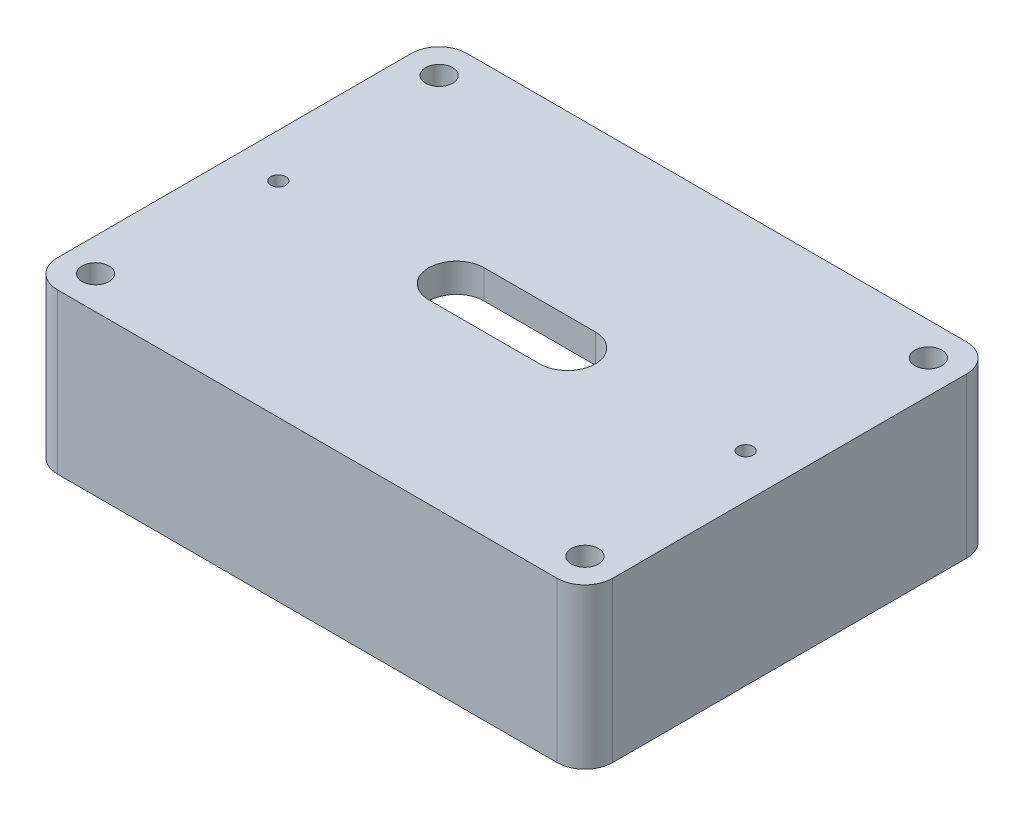
ISO-10303-21;
HEADER;
FILE_DESCRIPTION(('STEP AP214'),'2;1');
FILE_NAME('part.step','',(''),(''),'','','');
FILE_SCHEMA(('AUTOMOTIVE_DESIGN { 1 0 10303 214 1 1 1 1 }'));
ENDSEC;
DATA;
#1=APPLICATION_CONTEXT('core data for automotive mechanical design processes');
#2=APPLICATION_PROTOCOL_DEFINITION('international standard','automotive_design',2000,#1);
#3=PRODUCT_CONTEXT('',#1,'mechanical');
#4=PRODUCT('Part','Part','',(#3));
#5=PRODUCT_RELATED_PRODUCT_CATEGORY('part','',(#4));
#6=PRODUCT_DEFINITION_FORMATION('','',#4);
#7=PRODUCT_DEFINITION_CONTEXT('part definition',#1,'design');
#8=PRODUCT_DEFINITION('design','',#6,#7);
#9=PRODUCT_DEFINITION_SHAPE('','',#8);
#10=(LENGTH_UNIT() NAMED_UNIT(*) SI_UNIT(.MILLI.,.METRE.));
#11=(NAMED_UNIT(*) PLANE_ANGLE_UNIT() SI_UNIT($,.RADIAN.));
#12=(NAMED_UNIT(*) SI_UNIT($,.STERADIAN.) SOLID_ANGLE_UNIT());
#13=UNCERTAINTY_MEASURE_WITH_UNIT(LENGTH_MEASURE(1.E-05),#10,'distance_accuracy_value','');
#14=(GEOMETRIC_REPRESENTATION_CONTEXT(3) GLOBAL_UNCERTAINTY_ASSIGNED_CONTEXT((#13)) GLOBAL_UNIT_ASSIGNED_CONTEXT((#10,
#11,#12)) REPRESENTATION_CONTEXT('',''));
#15=CARTESIAN_POINT('',(0.,0.,0.));
#16=DIRECTION('',(0.,0.,1.));
#17=DIRECTION('',(1.,0.,0.));
#18=AXIS2_PLACEMENT_3D('',#15,#16,#17);
#19=CARTESIAN_POINT('',(-35.85,23.,29.5));
#20=DIRECTION('',(1.,0.,0.));
#21=DIRECTION('',(0.,0.,-1.));
#22=AXIS2_PLACEMENT_3D('',#19,#20,#21);
#23=PLANE('',#22);
#24=DIRECTION('',(0.,-1.,0.));
#25=VECTOR('',#24,1.);
#26=CARTESIAN_POINT('',(-35.85,18.85,9.));
#27=LINE('',#26,#25);
#28=CARTESIAN_POINT('',(-35.85,18.85,9.));
#29=VERTEX_POINT('',#28);
#30=CARTESIAN_POINT('',(-35.85,0.,9.));
#31=VERTEX_POINT('',#30);
#32=EDGE_CURVE('E253',#29,#31,#27,.T.);
#33=ORIENTED_EDGE('',*,*,#32,.F.);
#34=DIRECTION('',(0.,0.,1.));
#35=VECTOR('',#34,1.);
#36=CARTESIAN_POINT('',(-35.85,18.85,0.));
#37=LINE('',#36,#35);
#38=CARTESIAN_POINT('',(-35.85,18.85,18.6795799156895));
#39=VERTEX_POINT('',#38);
#40=EDGE_CURVE('E294',#29,#39,#37,.T.);
#41=ORIENTED_EDGE('',*,*,#40,.T.);
#42=DIRECTION('',(0.,1.,0.));
#43=VECTOR('',#42,1.);
#44=CARTESIAN_POINT('',(-35.85,0.,18.6795799156895));
#45=LINE('',#44,#43);
#46=CARTESIAN_POINT('',(-35.85,0.,18.6795799156895));
#47=VERTEX_POINT('',#46);
#48=EDGE_CURVE('E339',#47,#39,#45,.T.);
#49=ORIENTED_EDGE('',*,*,#48,.F.);
#50=DIRECTION('',(0.,0.,1.));
#51=VECTOR('',#50,1.);
#52=CARTESIAN_POINT('',(-35.85,0.,0.));
#53=LINE('',#52,#51);
#54=EDGE_CURVE('E325',#31,#47,#53,.T.);
#55=ORIENTED_EDGE('',*,*,#54,.F.);
#56=EDGE_LOOP('',(#33,#41,#49,#55));
#57=FACE_BOUND('',#56,.T.);
#58=ADVANCED_FACE('F33',(#57),#23,.T.);
#59=CARTESIAN_POINT('',(40.,23.,29.5));
#60=DIRECTION('',(-1.,0.,0.));
#61=DIRECTION('',(0.,0.,1.));
#62=AXIS2_PLACEMENT_3D('',#59,#60,#61);
#63=PLANE('',#62);
#64=DIRECTION('',(0.,0.,-1.));
#65=VECTOR('',#64,1.);
#66=CARTESIAN_POINT('',(40.,0.,29.5));
#67=LINE('',#66,#65);
#68=CARTESIAN_POINT('',(40.,0.,25.5));
#69=VERTEX_POINT('',#68);
#70=CARTESIAN_POINT('',(40.,0.,-25.5));
#71=VERTEX_POINT('',#70);
#72=EDGE_CURVE('E374',#69,#71,#67,.T.);
#73=ORIENTED_EDGE('',*,*,#72,.T.);
#74=DIRECTION('',(0.,-1.,0.));
#75=VECTOR('',#74,1.);
#76=CARTESIAN_POINT('',(40.,23.,-25.5));
#77=LINE('',#76,#75);
#78=CARTESIAN_POINT('',(40.,23.,-25.5));
#79=VERTEX_POINT('',#78);
#80=EDGE_CURVE('E427',#71,#79,#77,.F.);
#81=ORIENTED_EDGE('',*,*,#80,.T.);
#82=DIRECTION('',(0.,0.,-1.));
#83=VECTOR('',#82,1.);
#84=CARTESIAN_POINT('',(40.,23.,29.5));
#85=LINE('',#84,#83);
#86=CARTESIAN_POINT('',(40.,23.,25.5));
#87=VERTEX_POINT('',#86);
#88=EDGE_CURVE('E377',#87,#79,#85,.T.);
#89=ORIENTED_EDGE('',*,*,#88,.F.);
#90=DIRECTION('',(0.,-1.,0.));
#91=VECTOR('',#90,1.);
#92=CARTESIAN_POINT('',(40.,23.,25.5));
#93=LINE('',#92,#91);
#94=EDGE_CURVE('E424',#87,#69,#93,.T.);
#95=ORIENTED_EDGE('',*,*,#94,.T.);
#96=EDGE_LOOP('',(#73,#81,#89,#95));
#97=FACE_BOUND('',#96,.T.);
#98=ADVANCED_FACE('F508',(#97),#63,.F.);
#99=CARTESIAN_POINT('',(-40.,23.,-29.5));
#100=DIRECTION('',(0.,0.,1.));
#101=DIRECTION('',(1.,0.,0.));
#102=AXIS2_PLACEMENT_3D('',#99,#100,#101);
#103=PLANE('',#102);
#104=DIRECTION('',(-1.,0.,0.));
#105=VECTOR('',#104,1.);
#106=CARTESIAN_POINT('',(-40.,23.,-29.5));
#107=LINE('',#106,#105);
#108=CARTESIAN_POINT('',(36.,23.,-29.5));
#109=VERTEX_POINT('',#108);
#110=CARTESIAN_POINT('',(-36.,23.,-29.5));
#111=VERTEX_POINT('',#110);
#112=EDGE_CURVE('E380',#109,#111,#107,.T.);
#113=ORIENTED_EDGE('',*,*,#112,.F.);
#114=DIRECTION('',(0.,-1.,0.));
#115=VECTOR('',#114,1.);
#116=CARTESIAN_POINT('',(36.,23.,-29.5));
#117=LINE('',#116,#115);
#118=CARTESIAN_POINT('',(36.,0.,-29.5));
#119=VERTEX_POINT('',#118);
#120=EDGE_CURVE('E412',#109,#119,#117,.T.);
#121=ORIENTED_EDGE('',*,*,#120,.T.);
#122=DIRECTION('',(-1.,0.,0.));
#123=VECTOR('',#122,1.);
#124=CARTESIAN_POINT('',(-40.,0.,-29.5));
#125=LINE('',#124,#123);
#126=CARTESIAN_POINT('',(-36.,0.,-29.5));
#127=VERTEX_POINT('',#126);
#128=EDGE_CURVE('E393',#119,#127,#125,.T.);
#129=ORIENTED_EDGE('',*,*,#128,.T.);
#130=DIRECTION('',(0.,-1.,0.));
#131=VECTOR('',#130,1.);
#132=CARTESIAN_POINT('',(-36.,23.,-29.5));
#133=LINE('',#132,#131);
#134=EDGE_CURVE('E410',#127,#111,#133,.F.);
#135=ORIENTED_EDGE('',*,*,#134,.T.);
#136=EDGE_LOOP('',(#113,#121,#129,#135));
#137=FACE_BOUND('',#136,.T.);
#138=ADVANCED_FACE('F515',(#137),#103,.F.);
#139=CARTESIAN_POINT('',(-40.,23.,29.5));
#140=DIRECTION('',(1.,0.,0.));
#141=DIRECTION('',(0.,0.,-1.));
#142=AXIS2_PLACEMENT_3D('',#139,#140,#141);
#143=PLANE('',#142);
#144=DIRECTION('',(0.,0.,1.));
#145=VECTOR('',#144,1.);
#146=CARTESIAN_POINT('',(-40.,0.,29.5));
#147=LINE('',#146,#145);
#148=CARTESIAN_POINT('',(-40.,0.,-25.5));
#149=VERTEX_POINT('',#148);
#150=CARTESIAN_POINT('',(-40.,0.,-8.));
#151=VERTEX_POINT('',#150);
#152=EDGE_CURVE('E397',#149,#151,#147,.T.);
#153=ORIENTED_EDGE('',*,*,#152,.T.);
#154=DIRECTION('',(0.,-1.,0.));
#155=VECTOR('',#154,1.);
#156=CARTESIAN_POINT('',(-40.,23.,-8.));
#157=LINE('',#156,#155);
#158=CARTESIAN_POINT('',(-40.,6.,-8.));
#159=VERTEX_POINT('',#158);
#160=EDGE_CURVE('E41',#151,#159,#157,.F.);
#161=ORIENTED_EDGE('',*,*,#160,.T.);
#162=DIRECTION('',(0.,0.,-1.));
#163=VECTOR('',#162,1.);
#164=CARTESIAN_POINT('',(-40.,6.,29.5));
#165=LINE('',#164,#163);
#166=CARTESIAN_POINT('',(-40.,6.,8.));
#167=VERTEX_POINT('',#166);
#168=EDGE_CURVE('E452',#159,#167,#165,.F.);
#169=ORIENTED_EDGE('',*,*,#168,.T.);
#170=DIRECTION('',(0.,1.,0.));
#171=VECTOR('',#170,1.);
#172=CARTESIAN_POINT('',(-40.,23.,8.00000000000001));
#173=LINE('',#172,#171);
#174=CARTESIAN_POINT('',(-40.,0.,8.));
#175=VERTEX_POINT('',#174);
#176=EDGE_CURVE('E454',#167,#175,#173,.F.);
#177=ORIENTED_EDGE('',*,*,#176,.T.);
#178=CARTESIAN_POINT('',(-40.,0.,25.5));
#179=VERTEX_POINT('',#178);
#180=EDGE_CURVE('E396',#175,#179,#147,.T.);
#181=ORIENTED_EDGE('',*,*,#180,.T.);
#182=DIRECTION('',(0.,-1.,0.));
#183=VECTOR('',#182,1.);
#184=CARTESIAN_POINT('',(-40.,23.,25.5));
#185=LINE('',#184,#183);
#186=CARTESIAN_POINT('',(-40.,23.,25.5));
#187=VERTEX_POINT('',#186);
#188=EDGE_CURVE('E445',#179,#187,#185,.F.);
#189=ORIENTED_EDGE('',*,*,#188,.T.);
#190=DIRECTION('',(0.,0.,1.));
#191=VECTOR('',#190,1.);
#192=CARTESIAN_POINT('',(-40.,23.,29.5));
#193=LINE('',#192,#191);
#194=CARTESIAN_POINT('',(-40.,23.,-25.5));
#195=VERTEX_POINT('',#194);
#196=EDGE_CURVE('E384',#195,#187,#193,.T.);
#197=ORIENTED_EDGE('',*,*,#196,.F.);
#198=DIRECTION('',(0.,-1.,0.));
#199=VECTOR('',#198,1.);
#200=CARTESIAN_POINT('',(-40.,23.,-25.5));
#201=LINE('',#200,#199);
#202=EDGE_CURVE('E442',#195,#149,#201,.T.);
#203=ORIENTED_EDGE('',*,*,#202,.T.);
#204=EDGE_LOOP('',(#153,#161,#169,#177,#181,#189,#197,#203));
#205=FACE_BOUND('',#204,.T.);
#206=ADVANCED_FACE('F568',(#205),#143,.F.);
#207=CARTESIAN_POINT('',(-40.,23.,29.5));
#208=DIRECTION('',(0.,0.,-1.));
#209=DIRECTION('',(-1.,0.,0.));
#210=AXIS2_PLACEMENT_3D('',#207,#208,#209);
#211=PLANE('',#210);
#212=DIRECTION('',(1.,0.,0.));
#213=VECTOR('',#212,1.);
#214=CARTESIAN_POINT('',(-40.,0.,29.5));
#215=LINE('',#214,#213);
#216=CARTESIAN_POINT('',(-36.,0.,29.5));
#217=VERTEX_POINT('',#216);
#218=CARTESIAN_POINT('',(36.,0.,29.5));
#219=VERTEX_POINT('',#218);
#220=EDGE_CURVE('E381',#217,#219,#215,.T.);
#221=ORIENTED_EDGE('',*,*,#220,.T.);
#222=DIRECTION('',(0.,-1.,0.));
#223=VECTOR('',#222,1.);
#224=CARTESIAN_POINT('',(36.,23.,29.5));
#225=LINE('',#224,#223);
#226=CARTESIAN_POINT('',(36.,23.,29.5));
#227=VERTEX_POINT('',#226);
#228=EDGE_CURVE('E440',#219,#227,#225,.F.);
#229=ORIENTED_EDGE('',*,*,#228,.T.);
#230=DIRECTION('',(1.,0.,0.));
#231=VECTOR('',#230,1.);
#232=CARTESIAN_POINT('',(-40.,23.,29.5));
#233=LINE('',#232,#231);
#234=CARTESIAN_POINT('',(-36.,23.,29.5));
#235=VERTEX_POINT('',#234);
#236=EDGE_CURVE('E387',#235,#227,#233,.T.);
#237=ORIENTED_EDGE('',*,*,#236,.F.);
#238=DIRECTION('',(0.,-1.,0.));
#239=VECTOR('',#238,1.);
#240=CARTESIAN_POINT('',(-36.,23.,29.5));
#241=LINE('',#240,#239);
#242=EDGE_CURVE('E437',#235,#217,#241,.T.);
#243=ORIENTED_EDGE('',*,*,#242,.T.);
#244=EDGE_LOOP('',(#221,#229,#237,#243));
#245=FACE_BOUND('',#244,.T.);
#246=ADVANCED_FACE('F616',(#245),#211,.F.);
#247=CARTESIAN_POINT('',(0.,23.,0.));
#248=DIRECTION('',(0.,-1.,0.));
#249=DIRECTION('',(0.,0.,-1.));
#250=AXIS2_PLACEMENT_3D('',#247,#248,#249);
#251=PLANE('',#250);
#252=CARTESIAN_POINT('',(33.67,23.,0.));
#253=DIRECTION('',(0.,1.,0.));
#254=DIRECTION('',(0.,0.,1.));
#255=AXIS2_PLACEMENT_3D('',#252,#253,#254);
#256=CIRCLE('',#255,1.08);
#257=CARTESIAN_POINT('',(33.67,23.,1.08));
#258=VERTEX_POINT('',#257);
#259=EDGE_CURVE('E260',#258,#258,#256,.T.);
#260=ORIENTED_EDGE('',*,*,#259,.F.);
#261=EDGE_LOOP('',(#260));
#262=FACE_BOUND('',#261,.T.);
#263=CARTESIAN_POINT('',(-33.67,23.,0.));
#264=DIRECTION('',(0.,1.,0.));
#265=DIRECTION('',(0.,0.,1.));
#266=AXIS2_PLACEMENT_3D('',#263,#264,#265);
#267=CIRCLE('',#266,1.08);
#268=CARTESIAN_POINT('',(-33.67,23.,1.08));
#269=VERTEX_POINT('',#268);
#270=EDGE_CURVE('E259',#269,#269,#267,.T.);
#271=ORIENTED_EDGE('',*,*,#270,.F.);
#272=EDGE_LOOP('',(#271));
#273=FACE_BOUND('',#272,.T.);
#274=DIRECTION('',(-1.,0.,0.));
#275=VECTOR('',#274,1.);
#276=CARTESIAN_POINT('',(8.00000000000001,23.,-4.));
#277=LINE('',#276,#275);
#278=CARTESIAN_POINT('',(8.00000000000001,23.,-4.));
#279=VERTEX_POINT('',#278);
#280=CARTESIAN_POINT('',(-7.99999999999999,23.,-4.));
#281=VERTEX_POINT('',#280);
#282=EDGE_CURVE('E268',#279,#281,#277,.T.);
#283=ORIENTED_EDGE('',*,*,#282,.F.);
#284=CARTESIAN_POINT('',(8.00000000000001,23.,0.));
#285=DIRECTION('',(0.,1.,0.));
#286=DIRECTION('',(0.,0.,1.));
#287=AXIS2_PLACEMENT_3D('',#284,#285,#286);
#288=CIRCLE('',#287,4.);
#289=CARTESIAN_POINT('',(8.00000000000001,23.,4.));
#290=VERTEX_POINT('',#289);
#291=EDGE_CURVE('E266',#290,#279,#288,.T.);
#292=ORIENTED_EDGE('',*,*,#291,.F.);
#293=DIRECTION('',(1.,0.,0.));
#294=VECTOR('',#293,1.);
#295=CARTESIAN_POINT('',(8.00000000000001,23.,4.));
#296=LINE('',#295,#294);
#297=CARTESIAN_POINT('',(-7.99999999999999,23.,4.));
#298=VERTEX_POINT('',#297);
#299=EDGE_CURVE('E274',#298,#290,#296,.T.);
#300=ORIENTED_EDGE('',*,*,#299,.F.);
#301=CARTESIAN_POINT('',(-7.99999999999999,23.,0.));
#302=DIRECTION('',(0.,1.,0.));
#303=DIRECTION('',(0.,0.,1.));
#304=AXIS2_PLACEMENT_3D('',#301,#302,#303);
#305=CIRCLE('',#304,4.);
#306=EDGE_CURVE('E271',#281,#298,#305,.T.);
#307=ORIENTED_EDGE('',*,*,#306,.F.);
#308=EDGE_LOOP('',(#283,#292,#300,#307));
#309=FACE_BOUND('',#308,.T.);
#310=CARTESIAN_POINT('',(35.25,23.,24.75));
#311=DIRECTION('',(0.,1.,0.));
#312=DIRECTION('',(0.,0.,1.));
#313=AXIS2_PLACEMENT_3D('',#310,#311,#312);
#314=CIRCLE('',#313,1.95);
#315=CARTESIAN_POINT('',(35.25,23.,26.7));
#316=VERTEX_POINT('',#315);
#317=EDGE_CURVE('E363',#316,#316,#314,.T.);
#318=ORIENTED_EDGE('',*,*,#317,.F.);
#319=EDGE_LOOP('',(#318));
#320=FACE_BOUND('',#319,.T.);
#321=CARTESIAN_POINT('',(-35.25,23.,-24.75));
#322=DIRECTION('',(0.,1.,0.));
#323=DIRECTION('',(0.,0.,1.));
#324=AXIS2_PLACEMENT_3D('',#321,#322,#323);
#325=CIRCLE('',#324,1.95);
#326=CARTESIAN_POINT('',(-35.25,23.,-22.8));
#327=VERTEX_POINT('',#326);
#328=EDGE_CURVE('E356',#327,#327,#325,.T.);
#329=ORIENTED_EDGE('',*,*,#328,.F.);
#330=EDGE_LOOP('',(#329));
#331=FACE_BOUND('',#330,.T.);
#332=CARTESIAN_POINT('',(-35.25,23.,24.75));
#333=DIRECTION('',(0.,1.,0.));
#334=DIRECTION('',(0.,0.,1.));
#335=AXIS2_PLACEMENT_3D('',#332,#333,#334);
#336=CIRCLE('',#335,1.95);
#337=CARTESIAN_POINT('',(-35.25,23.,26.7));
#338=VERTEX_POINT('',#337);
#339=EDGE_CURVE('E352',#338,#338,#336,.T.);
#340=ORIENTED_EDGE('',*,*,#339,.F.);
#341=EDGE_LOOP('',(#340));
#342=FACE_BOUND('',#341,.T.);
#343=CARTESIAN_POINT('',(35.25,23.,-24.75));
#344=DIRECTION('',(0.,1.,0.));
#345=DIRECTION('',(0.,0.,1.));
#346=AXIS2_PLACEMENT_3D('',#343,#344,#345);
#347=CIRCLE('',#346,1.95);
#348=CARTESIAN_POINT('',(35.25,23.,-22.8));
#349=VERTEX_POINT('',#348);
#350=EDGE_CURVE('E362',#349,#349,#347,.T.);
#351=ORIENTED_EDGE('',*,*,#350,.F.);
#352=EDGE_LOOP('',(#351));
#353=FACE_BOUND('',#352,.T.);
#354=ORIENTED_EDGE('',*,*,#88,.T.);
#355=CARTESIAN_POINT('',(36.,23.,-25.5));
#356=DIRECTION('',(0.,-1.,0.));
#357=DIRECTION('',(0.,0.,-1.));
#358=AXIS2_PLACEMENT_3D('',#355,#356,#357);
#359=CIRCLE('',#358,4.);
#360=EDGE_CURVE('E435',#79,#109,#359,.F.);
#361=ORIENTED_EDGE('',*,*,#360,.T.);
#362=ORIENTED_EDGE('',*,*,#112,.T.);
#363=CARTESIAN_POINT('',(-36.,23.,-25.5));
#364=DIRECTION('',(0.,-1.,0.));
#365=DIRECTION('',(0.,0.,-1.));
#366=AXIS2_PLACEMENT_3D('',#363,#364,#365);
#367=CIRCLE('',#366,4.);
#368=EDGE_CURVE('E429',#111,#195,#367,.F.);
#369=ORIENTED_EDGE('',*,*,#368,.T.);
#370=ORIENTED_EDGE('',*,*,#196,.T.);
#371=CARTESIAN_POINT('',(-36.,23.,25.5));
#372=DIRECTION('',(0.,-1.,0.));
#373=DIRECTION('',(0.,0.,-1.));
#374=AXIS2_PLACEMENT_3D('',#371,#372,#373);
#375=CIRCLE('',#374,4.);
#376=EDGE_CURVE('E431',#187,#235,#375,.F.);
#377=ORIENTED_EDGE('',*,*,#376,.T.);
#378=ORIENTED_EDGE('',*,*,#236,.T.);
#379=CARTESIAN_POINT('',(36.,23.,25.5));
#380=DIRECTION('',(0.,-1.,0.));
#381=DIRECTION('',(0.,0.,-1.));
#382=AXIS2_PLACEMENT_3D('',#379,#380,#381);
#383=CIRCLE('',#382,4.);
#384=EDGE_CURVE('E433',#227,#87,#383,.F.);
#385=ORIENTED_EDGE('',*,*,#384,.T.);
#386=EDGE_LOOP('',(#354,#361,#362,#369,#370,#377,#378,#385));
#387=FACE_BOUND('',#386,.T.);
#388=ADVANCED_FACE('F492',(#262,#273,#309,#320,#331,#342,#353,#387),#251,.F.);
#389=CARTESIAN_POINT('',(0.,0.,0.));
#390=DIRECTION('',(0.,-1.,0.));
#391=DIRECTION('',(0.,0.,-1.));
#392=AXIS2_PLACEMENT_3D('',#389,#390,#391);
#393=PLANE('',#392);
#394=DIRECTION('',(0.,0.,-1.));
#395=VECTOR('',#394,1.);
#396=CARTESIAN_POINT('',(-38.25,0.,-9.));
#397=LINE('',#396,#395);
#398=CARTESIAN_POINT('',(-38.25,0.,9.));
#399=VERTEX_POINT('',#398);
#400=CARTESIAN_POINT('',(-38.25,0.,5.27282197134108));
#401=VERTEX_POINT('',#400);
#402=EDGE_CURVE('E248',#399,#401,#397,.T.);
#403=ORIENTED_EDGE('',*,*,#402,.F.);
#404=DIRECTION('',(-1.,0.,0.));
#405=VECTOR('',#404,1.);
#406=CARTESIAN_POINT('',(-38.25,0.,9.));
#407=LINE('',#406,#405);
#408=EDGE_CURVE('E241',#31,#399,#407,.T.);
#409=ORIENTED_EDGE('',*,*,#408,.F.);
#410=ORIENTED_EDGE('',*,*,#54,.T.);
#411=CARTESIAN_POINT('',(-35.25,0.,24.75));
#412=DIRECTION('',(0.,-1.,0.));
#413=DIRECTION('',(0.,0.,-1.));
#414=AXIS2_PLACEMENT_3D('',#411,#412,#413);
#415=CIRCLE('',#414,6.1);
#416=CARTESIAN_POINT('',(-29.1795799156895,0.,25.35));
#417=VERTEX_POINT('',#416);
#418=EDGE_CURVE('E309',#417,#47,#415,.F.);
#419=ORIENTED_EDGE('',*,*,#418,.F.);
#420=DIRECTION('',(1.,0.,0.));
#421=VECTOR('',#420,1.);
#422=CARTESIAN_POINT('',(0.,0.,25.35));
#423=LINE('',#422,#421);
#424=CARTESIAN_POINT('',(29.1795799156895,0.,25.35));
#425=VERTEX_POINT('',#424);
#426=EDGE_CURVE('E291',#417,#425,#423,.T.);
#427=ORIENTED_EDGE('',*,*,#426,.T.);
#428=CARTESIAN_POINT('',(35.25,0.,24.75));
#429=DIRECTION('',(0.,-1.,0.));
#430=DIRECTION('',(0.,0.,-1.));
#431=AXIS2_PLACEMENT_3D('',#428,#429,#430);
#432=CIRCLE('',#431,6.1);
#433=CARTESIAN_POINT('',(35.85,0.,18.6795799156895));
#434=VERTEX_POINT('',#433);
#435=EDGE_CURVE('E304',#434,#425,#432,.F.);
#436=ORIENTED_EDGE('',*,*,#435,.F.);
#437=DIRECTION('',(0.,0.,-1.));
#438=VECTOR('',#437,1.);
#439=CARTESIAN_POINT('',(35.85,0.,0.));
#440=LINE('',#439,#438);
#441=CARTESIAN_POINT('',(35.85,0.,-18.6795799156895));
#442=VERTEX_POINT('',#441);
#443=EDGE_CURVE('E316',#434,#442,#440,.T.);
#444=ORIENTED_EDGE('',*,*,#443,.T.);
#445=CARTESIAN_POINT('',(35.25,0.,-24.75));
#446=DIRECTION('',(0.,-1.,0.));
#447=DIRECTION('',(0.,0.,-1.));
#448=AXIS2_PLACEMENT_3D('',#445,#446,#447);
#449=CIRCLE('',#448,6.1);
#450=CARTESIAN_POINT('',(29.1795799156895,0.,-25.35));
#451=VERTEX_POINT('',#450);
#452=EDGE_CURVE('E315',#451,#442,#449,.F.);
#453=ORIENTED_EDGE('',*,*,#452,.F.);
#454=DIRECTION('',(-1.,0.,0.));
#455=VECTOR('',#454,1.);
#456=CARTESIAN_POINT('',(0.,0.,-25.35));
#457=LINE('',#456,#455);
#458=CARTESIAN_POINT('',(-29.1795799156895,0.,-25.35));
#459=VERTEX_POINT('',#458);
#460=EDGE_CURVE('E319',#451,#459,#457,.T.);
#461=ORIENTED_EDGE('',*,*,#460,.T.);
#462=CARTESIAN_POINT('',(-35.25,0.,-24.75));
#463=DIRECTION('',(0.,-1.,0.));
#464=DIRECTION('',(0.,0.,-1.));
#465=AXIS2_PLACEMENT_3D('',#462,#463,#464);
#466=CIRCLE('',#465,6.1);
#467=CARTESIAN_POINT('',(-35.85,0.,-18.6795799156895));
#468=VERTEX_POINT('',#467);
#469=EDGE_CURVE('E305',#468,#459,#466,.F.);
#470=ORIENTED_EDGE('',*,*,#469,.F.);
#471=CARTESIAN_POINT('',(-35.85,0.,-9.));
#472=VERTEX_POINT('',#471);
#473=EDGE_CURVE('E322',#468,#472,#53,.T.);
#474=ORIENTED_EDGE('',*,*,#473,.T.);
#475=DIRECTION('',(1.,0.,0.));
#476=VECTOR('',#475,1.);
#477=CARTESIAN_POINT('',(-38.25,0.,-9.));
#478=LINE('',#477,#476);
#479=CARTESIAN_POINT('',(-38.25,0.,-9.));
#480=VERTEX_POINT('',#479);
#481=EDGE_CURVE('E244',#480,#472,#478,.T.);
#482=ORIENTED_EDGE('',*,*,#481,.F.);
#483=CARTESIAN_POINT('',(-38.25,0.,-5.27282197134107));
#484=VERTEX_POINT('',#483);
#485=EDGE_CURVE('E224',#484,#480,#397,.T.);
#486=ORIENTED_EDGE('',*,*,#485,.F.);
#487=CARTESIAN_POINT('',(-37.,0.,-8.));
#488=DIRECTION('',(0.,-1.,0.));
#489=DIRECTION('',(0.,0.,-1.));
#490=AXIS2_PLACEMENT_3D('',#487,#488,#489);
#491=CIRCLE('',#490,3.);
#492=EDGE_CURVE('E450',#484,#151,#491,.T.);
#493=ORIENTED_EDGE('',*,*,#492,.T.);
#494=ORIENTED_EDGE('',*,*,#152,.F.);
#495=CARTESIAN_POINT('',(-36.,0.,-25.5));
#496=DIRECTION('',(0.,-1.,0.));
#497=DIRECTION('',(0.,0.,-1.));
#498=AXIS2_PLACEMENT_3D('',#495,#496,#497);
#499=CIRCLE('',#498,4.);
#500=EDGE_CURVE('E415',#149,#127,#499,.T.);
#501=ORIENTED_EDGE('',*,*,#500,.T.);
#502=ORIENTED_EDGE('',*,*,#128,.F.);
#503=CARTESIAN_POINT('',(36.,0.,-25.5));
#504=DIRECTION('',(0.,-1.,0.));
#505=DIRECTION('',(0.,0.,-1.));
#506=AXIS2_PLACEMENT_3D('',#503,#504,#505);
#507=CIRCLE('',#506,4.);
#508=EDGE_CURVE('E422',#119,#71,#507,.T.);
#509=ORIENTED_EDGE('',*,*,#508,.T.);
#510=ORIENTED_EDGE('',*,*,#72,.F.);
#511=CARTESIAN_POINT('',(36.,0.,25.5));
#512=DIRECTION('',(0.,-1.,0.));
#513=DIRECTION('',(0.,0.,-1.));
#514=AXIS2_PLACEMENT_3D('',#511,#512,#513);
#515=CIRCLE('',#514,4.);
#516=EDGE_CURVE('E420',#69,#219,#515,.T.);
#517=ORIENTED_EDGE('',*,*,#516,.T.);
#518=ORIENTED_EDGE('',*,*,#220,.F.);
#519=CARTESIAN_POINT('',(-36.,0.,25.5));
#520=DIRECTION('',(0.,-1.,0.));
#521=DIRECTION('',(0.,0.,-1.));
#522=AXIS2_PLACEMENT_3D('',#519,#520,#521);
#523=CIRCLE('',#522,4.);
#524=EDGE_CURVE('E417',#217,#179,#523,.T.);
#525=ORIENTED_EDGE('',*,*,#524,.T.);
#526=ORIENTED_EDGE('',*,*,#180,.F.);
#527=CARTESIAN_POINT('',(-37.,0.,8.));
#528=DIRECTION('',(0.,-1.,0.));
#529=DIRECTION('',(0.,0.,-1.));
#530=AXIS2_PLACEMENT_3D('',#527,#528,#529);
#531=CIRCLE('',#530,3.);
#532=EDGE_CURVE('E447',#175,#401,#531,.T.);
#533=ORIENTED_EDGE('',*,*,#532,.T.);
#534=EDGE_LOOP('',(#403,#409,#410,#419,#427,#436,#444,#453,#461,#470,#474,#482,#486,#493,#494,
#501,#502,#509,#510,#517,#518,#525,#526,#533));
#535=FACE_BOUND('',#534,.T.);
#536=CARTESIAN_POINT('',(35.25,0.,24.75));
#537=DIRECTION('',(0.,1.,0.));
#538=DIRECTION('',(0.,0.,1.));
#539=AXIS2_PLACEMENT_3D('',#536,#537,#538);
#540=CIRCLE('',#539,1.95);
#541=CARTESIAN_POINT('',(35.25,0.,26.7));
#542=VERTEX_POINT('',#541);
#543=EDGE_CURVE('E359',#542,#542,#540,.T.);
#544=ORIENTED_EDGE('',*,*,#543,.T.);
#545=EDGE_LOOP('',(#544));
#546=FACE_BOUND('',#545,.T.);
#547=CARTESIAN_POINT('',(-35.25,0.,-24.75));
#548=DIRECTION('',(0.,1.,0.));
#549=DIRECTION('',(0.,0.,1.));
#550=AXIS2_PLACEMENT_3D('',#547,#548,#549);
#551=CIRCLE('',#550,1.95);
#552=CARTESIAN_POINT('',(-35.25,0.,-22.8));
#553=VERTEX_POINT('',#552);
#554=EDGE_CURVE('E366',#553,#553,#551,.T.);
#555=ORIENTED_EDGE('',*,*,#554,.T.);
#556=EDGE_LOOP('',(#555));
#557=FACE_BOUND('',#556,.T.);
#558=CARTESIAN_POINT('',(-35.25,0.,24.75));
#559=DIRECTION('',(0.,1.,0.));
#560=DIRECTION('',(0.,0.,1.));
#561=AXIS2_PLACEMENT_3D('',#558,#559,#560);
#562=CIRCLE('',#561,1.95);
#563=CARTESIAN_POINT('',(-35.25,0.,26.7));
#564=VERTEX_POINT('',#563);
#565=EDGE_CURVE('E353',#564,#564,#562,.T.);
#566=ORIENTED_EDGE('',*,*,#565,.T.);
#567=EDGE_LOOP('',(#566));
#568=FACE_BOUND('',#567,.T.);
#569=CARTESIAN_POINT('',(35.25,0.,-24.75));
#570=DIRECTION('',(0.,1.,0.));
#571=DIRECTION('',(0.,0.,1.));
#572=AXIS2_PLACEMENT_3D('',#569,#570,#571);
#573=CIRCLE('',#572,1.95);
#574=CARTESIAN_POINT('',(35.25,0.,-22.8));
#575=VERTEX_POINT('',#574);
#576=EDGE_CURVE('E371',#575,#575,#573,.T.);
#577=ORIENTED_EDGE('',*,*,#576,.T.);
#578=EDGE_LOOP('',(#577));
#579=FACE_BOUND('',#578,.T.);
#580=ADVANCED_FACE('F535',(#535,#546,#557,#568,#579),#393,.T.);
#581=CARTESIAN_POINT('',(35.25,0.,-24.75));
#582=DIRECTION('',(0.,1.,0.));
#583=DIRECTION('',(0.,0.,1.));
#584=AXIS2_PLACEMENT_3D('',#581,#582,#583);
#585=CYLINDRICAL_SURFACE('',#584,1.95);
#586=ORIENTED_EDGE('',*,*,#576,.F.);
#587=EDGE_LOOP('',(#586));
#588=FACE_BOUND('',#587,.T.);
#589=ORIENTED_EDGE('',*,*,#350,.T.);
#590=EDGE_LOOP('',(#589));
#591=FACE_BOUND('',#590,.T.);
#592=ADVANCED_FACE('F622',(#588,#591),#585,.F.);
#593=CARTESIAN_POINT('',(-35.25,0.,24.75));
#594=DIRECTION('',(0.,1.,0.));
#595=DIRECTION('',(0.,0.,1.));
#596=AXIS2_PLACEMENT_3D('',#593,#594,#595);
#597=CYLINDRICAL_SURFACE('',#596,1.95);
#598=ORIENTED_EDGE('',*,*,#565,.F.);
#599=EDGE_LOOP('',(#598));
#600=FACE_BOUND('',#599,.T.);
#601=ORIENTED_EDGE('',*,*,#339,.T.);
#602=EDGE_LOOP('',(#601));
#603=FACE_BOUND('',#602,.T.);
#604=ADVANCED_FACE('F628',(#600,#603),#597,.F.);
#605=CARTESIAN_POINT('',(-35.25,0.,-24.75));
#606=DIRECTION('',(0.,1.,0.));
#607=DIRECTION('',(0.,0.,1.));
#608=AXIS2_PLACEMENT_3D('',#605,#606,#607);
#609=CYLINDRICAL_SURFACE('',#608,1.95);
#610=ORIENTED_EDGE('',*,*,#554,.F.);
#611=EDGE_LOOP('',(#610));
#612=FACE_BOUND('',#611,.T.);
#613=ORIENTED_EDGE('',*,*,#328,.T.);
#614=EDGE_LOOP('',(#613));
#615=FACE_BOUND('',#614,.T.);
#616=ADVANCED_FACE('F630',(#612,#615),#609,.F.);
#617=CARTESIAN_POINT('',(35.25,0.,24.75));
#618=DIRECTION('',(0.,1.,0.));
#619=DIRECTION('',(0.,0.,1.));
#620=AXIS2_PLACEMENT_3D('',#617,#618,#619);
#621=CYLINDRICAL_SURFACE('',#620,1.95);
#622=ORIENTED_EDGE('',*,*,#543,.F.);
#623=EDGE_LOOP('',(#622));
#624=FACE_BOUND('',#623,.T.);
#625=ORIENTED_EDGE('',*,*,#317,.T.);
#626=EDGE_LOOP('',(#625));
#627=FACE_BOUND('',#626,.T.);
#628=ADVANCED_FACE('F633',(#624,#627),#621,.F.);
#629=CARTESIAN_POINT('',(35.85,23.,29.5));
#630=DIRECTION('',(-1.,0.,0.));
#631=DIRECTION('',(0.,0.,1.));
#632=AXIS2_PLACEMENT_3D('',#629,#630,#631);
#633=PLANE('',#632);
#634=DIRECTION('',(0.,1.,0.));
#635=VECTOR('',#634,1.);
#636=CARTESIAN_POINT('',(35.85,0.,18.6795799156895));
#637=LINE('',#636,#635);
#638=CARTESIAN_POINT('',(35.85,18.85,18.6795799156895));
#639=VERTEX_POINT('',#638);
#640=EDGE_CURVE('E348',#434,#639,#637,.T.);
#641=ORIENTED_EDGE('',*,*,#640,.T.);
#642=DIRECTION('',(0.,0.,-1.));
#643=VECTOR('',#642,1.);
#644=CARTESIAN_POINT('',(35.85,18.85,0.));
#645=LINE('',#644,#643);
#646=CARTESIAN_POINT('',(35.85,18.85,-18.6795799156895));
#647=VERTEX_POINT('',#646);
#648=EDGE_CURVE('E287',#639,#647,#645,.T.);
#649=ORIENTED_EDGE('',*,*,#648,.T.);
#650=DIRECTION('',(0.,1.,0.));
#651=VECTOR('',#650,1.);
#652=CARTESIAN_POINT('',(35.85,0.,-18.6795799156895));
#653=LINE('',#652,#651);
#654=EDGE_CURVE('E337',#442,#647,#653,.T.);
#655=ORIENTED_EDGE('',*,*,#654,.F.);
#656=ORIENTED_EDGE('',*,*,#443,.F.);
#657=EDGE_LOOP('',(#641,#649,#655,#656));
#658=FACE_BOUND('',#657,.T.);
#659=ADVANCED_FACE('F529',(#658),#633,.T.);
#660=CARTESIAN_POINT('',(-40.,23.,-25.35));
#661=DIRECTION('',(0.,0.,1.));
#662=DIRECTION('',(1.,0.,0.));
#663=AXIS2_PLACEMENT_3D('',#660,#661,#662);
#664=PLANE('',#663);
#665=ORIENTED_EDGE('',*,*,#460,.F.);
#666=DIRECTION('',(0.,1.,0.));
#667=VECTOR('',#666,1.);
#668=CARTESIAN_POINT('',(29.1795799156895,0.,-25.35));
#669=LINE('',#668,#667);
#670=CARTESIAN_POINT('',(29.1795799156895,18.85,-25.35));
#671=VERTEX_POINT('',#670);
#672=EDGE_CURVE('E300',#451,#671,#669,.T.);
#673=ORIENTED_EDGE('',*,*,#672,.T.);
#674=DIRECTION('',(-1.,0.,0.));
#675=VECTOR('',#674,1.);
#676=CARTESIAN_POINT('',(0.,18.85,-25.35));
#677=LINE('',#676,#675);
#678=CARTESIAN_POINT('',(-29.1795799156895,18.85,-25.35));
#679=VERTEX_POINT('',#678);
#680=EDGE_CURVE('E290',#671,#679,#677,.T.);
#681=ORIENTED_EDGE('',*,*,#680,.T.);
#682=DIRECTION('',(0.,1.,0.));
#683=VECTOR('',#682,1.);
#684=CARTESIAN_POINT('',(-29.1795799156895,0.,-25.35));
#685=LINE('',#684,#683);
#686=EDGE_CURVE('E346',#459,#679,#685,.T.);
#687=ORIENTED_EDGE('',*,*,#686,.F.);
#688=EDGE_LOOP('',(#665,#673,#681,#687));
#689=FACE_BOUND('',#688,.T.);
#690=ADVANCED_FACE('F522',(#689),#664,.T.);
#691=DIRECTION('',(0.,-1.,0.));
#692=VECTOR('',#691,1.);
#693=CARTESIAN_POINT('',(-35.85,18.85,-9.));
#694=LINE('',#693,#692);
#695=CARTESIAN_POINT('',(-35.85,18.85,-9.));
#696=VERTEX_POINT('',#695);
#697=EDGE_CURVE('E227',#696,#472,#694,.T.);
#698=ORIENTED_EDGE('',*,*,#697,.T.);
#699=ORIENTED_EDGE('',*,*,#473,.F.);
#700=DIRECTION('',(0.,1.,0.));
#701=VECTOR('',#700,1.);
#702=CARTESIAN_POINT('',(-35.85,0.,-18.6795799156895));
#703=LINE('',#702,#701);
#704=CARTESIAN_POINT('',(-35.85,18.85,-18.6795799156895));
#705=VERTEX_POINT('',#704);
#706=EDGE_CURVE('E344',#468,#705,#703,.T.);
#707=ORIENTED_EDGE('',*,*,#706,.T.);
#708=EDGE_CURVE('E295',#705,#696,#37,.T.);
#709=ORIENTED_EDGE('',*,*,#708,.T.);
#710=EDGE_LOOP('',(#698,#699,#707,#709));
#711=FACE_BOUND('',#710,.T.);
#712=ADVANCED_FACE('F511',(#711),#23,.T.);
#713=CARTESIAN_POINT('',(-40.,23.,25.35));
#714=DIRECTION('',(0.,0.,-1.));
#715=DIRECTION('',(-1.,0.,0.));
#716=AXIS2_PLACEMENT_3D('',#713,#714,#715);
#717=PLANE('',#716);
#718=ORIENTED_EDGE('',*,*,#426,.F.);
#719=DIRECTION('',(0.,1.,0.));
#720=VECTOR('',#719,1.);
#721=CARTESIAN_POINT('',(-29.1795799156895,0.,25.35));
#722=LINE('',#721,#720);
#723=CARTESIAN_POINT('',(-29.1795799156895,18.85,25.35));
#724=VERTEX_POINT('',#723);
#725=EDGE_CURVE('E342',#417,#724,#722,.T.);
#726=ORIENTED_EDGE('',*,*,#725,.T.);
#727=DIRECTION('',(1.,0.,0.));
#728=VECTOR('',#727,1.);
#729=CARTESIAN_POINT('',(0.,18.85,25.35));
#730=LINE('',#729,#728);
#731=CARTESIAN_POINT('',(29.1795799156895,18.85,25.35));
#732=VERTEX_POINT('',#731);
#733=EDGE_CURVE('E297',#724,#732,#730,.T.);
#734=ORIENTED_EDGE('',*,*,#733,.T.);
#735=DIRECTION('',(0.,1.,0.));
#736=VECTOR('',#735,1.);
#737=CARTESIAN_POINT('',(29.1795799156895,0.,25.35));
#738=LINE('',#737,#736);
#739=EDGE_CURVE('E350',#425,#732,#738,.T.);
#740=ORIENTED_EDGE('',*,*,#739,.F.);
#741=EDGE_LOOP('',(#718,#726,#734,#740));
#742=FACE_BOUND('',#741,.T.);
#743=ADVANCED_FACE('F472',(#742),#717,.T.);
#744=CARTESIAN_POINT('',(0.,18.85,0.));
#745=DIRECTION('',(0.,-1.,0.));
#746=DIRECTION('',(0.,0.,-1.));
#747=AXIS2_PLACEMENT_3D('',#744,#745,#746);
#748=PLANE('',#747);
#749=CARTESIAN_POINT('',(33.67,18.85,0.));
#750=DIRECTION('',(0.,-1.,0.));
#751=DIRECTION('',(0.,0.,-1.));
#752=AXIS2_PLACEMENT_3D('',#749,#750,#751);
#753=CIRCLE('',#752,1.08);
#754=CARTESIAN_POINT('',(33.67,18.85,-1.08));
#755=VERTEX_POINT('',#754);
#756=EDGE_CURVE('E460',#755,#755,#753,.T.);
#757=ORIENTED_EDGE('',*,*,#756,.F.);
#758=EDGE_LOOP('',(#757));
#759=FACE_BOUND('',#758,.T.);
#760=CARTESIAN_POINT('',(-33.67,18.85,0.));
#761=DIRECTION('',(0.,-1.,0.));
#762=DIRECTION('',(0.,0.,-1.));
#763=AXIS2_PLACEMENT_3D('',#760,#761,#762);
#764=CIRCLE('',#763,1.08);
#765=CARTESIAN_POINT('',(-33.67,18.85,-1.08));
#766=VERTEX_POINT('',#765);
#767=EDGE_CURVE('E263',#766,#766,#764,.T.);
#768=ORIENTED_EDGE('',*,*,#767,.F.);
#769=EDGE_LOOP('',(#768));
#770=FACE_BOUND('',#769,.T.);
#771=CARTESIAN_POINT('',(8.00000000000001,18.85,0.));
#772=DIRECTION('',(0.,-1.,0.));
#773=DIRECTION('',(0.,0.,-1.));
#774=AXIS2_PLACEMENT_3D('',#771,#772,#773);
#775=CIRCLE('',#774,4.);
#776=CARTESIAN_POINT('',(8.00000000000001,18.85,-4.));
#777=VERTEX_POINT('',#776);
#778=CARTESIAN_POINT('',(8.00000000000001,18.85,4.));
#779=VERTEX_POINT('',#778);
#780=EDGE_CURVE('E408',#777,#779,#775,.T.);
#781=ORIENTED_EDGE('',*,*,#780,.F.);
#782=DIRECTION('',(1.,0.,0.));
#783=VECTOR('',#782,1.);
#784=CARTESIAN_POINT('',(0.,18.85,-4.));
#785=LINE('',#784,#783);
#786=CARTESIAN_POINT('',(-7.99999999999999,18.85,-4.));
#787=VERTEX_POINT('',#786);
#788=EDGE_CURVE('E390',#787,#777,#785,.T.);
#789=ORIENTED_EDGE('',*,*,#788,.F.);
#790=CARTESIAN_POINT('',(-7.99999999999999,18.85,0.));
#791=DIRECTION('',(0.,-1.,0.));
#792=DIRECTION('',(0.,0.,-1.));
#793=AXIS2_PLACEMENT_3D('',#790,#791,#792);
#794=CIRCLE('',#793,4.);
#795=CARTESIAN_POINT('',(-7.99999999999999,18.85,4.));
#796=VERTEX_POINT('',#795);
#797=EDGE_CURVE('E403',#796,#787,#794,.T.);
#798=ORIENTED_EDGE('',*,*,#797,.F.);
#799=DIRECTION('',(-1.,0.,0.));
#800=VECTOR('',#799,1.);
#801=CARTESIAN_POINT('',(0.,18.85,4.));
#802=LINE('',#801,#800);
#803=EDGE_CURVE('E406',#779,#796,#802,.T.);
#804=ORIENTED_EDGE('',*,*,#803,.F.);
#805=EDGE_LOOP('',(#781,#789,#798,#804));
#806=FACE_BOUND('',#805,.T.);
#807=ORIENTED_EDGE('',*,*,#648,.F.);
#808=CARTESIAN_POINT('',(35.25,18.85,24.75));
#809=DIRECTION('',(0.,-1.,0.));
#810=DIRECTION('',(0.,0.,-1.));
#811=AXIS2_PLACEMENT_3D('',#808,#809,#810);
#812=CIRCLE('',#811,6.1);
#813=EDGE_CURVE('E301',#639,#732,#812,.F.);
#814=ORIENTED_EDGE('',*,*,#813,.T.);
#815=ORIENTED_EDGE('',*,*,#733,.F.);
#816=CARTESIAN_POINT('',(-35.25,18.85,24.75));
#817=DIRECTION('',(0.,-1.,0.));
#818=DIRECTION('',(0.,0.,-1.));
#819=AXIS2_PLACEMENT_3D('',#816,#817,#818);
#820=CIRCLE('',#819,6.1);
#821=EDGE_CURVE('E280',#724,#39,#820,.F.);
#822=ORIENTED_EDGE('',*,*,#821,.T.);
#823=ORIENTED_EDGE('',*,*,#40,.F.);
#824=DIRECTION('',(-1.,0.,0.));
#825=VECTOR('',#824,1.);
#826=CARTESIAN_POINT('',(-38.25,18.85,9.));
#827=LINE('',#826,#825);
#828=CARTESIAN_POINT('',(-38.25,18.85,9.));
#829=VERTEX_POINT('',#828);
#830=EDGE_CURVE('E228',#29,#829,#827,.T.);
#831=ORIENTED_EDGE('',*,*,#830,.T.);
#832=DIRECTION('',(0.,0.,-1.));
#833=VECTOR('',#832,1.);
#834=CARTESIAN_POINT('',(-38.25,18.85,-9.));
#835=LINE('',#834,#833);
#836=CARTESIAN_POINT('',(-38.25,18.85,-9.));
#837=VERTEX_POINT('',#836);
#838=EDGE_CURVE('E221',#829,#837,#835,.T.);
#839=ORIENTED_EDGE('',*,*,#838,.T.);
#840=DIRECTION('',(1.,0.,0.));
#841=VECTOR('',#840,1.);
#842=CARTESIAN_POINT('',(-38.25,18.85,-9.));
#843=LINE('',#842,#841);
#844=EDGE_CURVE('E231',#837,#696,#843,.T.);
#845=ORIENTED_EDGE('',*,*,#844,.T.);
#846=ORIENTED_EDGE('',*,*,#708,.F.);
#847=CARTESIAN_POINT('',(-35.25,18.85,-24.75));
#848=DIRECTION('',(0.,-1.,0.));
#849=DIRECTION('',(0.,0.,-1.));
#850=AXIS2_PLACEMENT_3D('',#847,#848,#849);
#851=CIRCLE('',#850,6.1);
#852=EDGE_CURVE('E306',#705,#679,#851,.F.);
#853=ORIENTED_EDGE('',*,*,#852,.T.);
#854=ORIENTED_EDGE('',*,*,#680,.F.);
#855=CARTESIAN_POINT('',(35.25,18.85,-24.75));
#856=DIRECTION('',(0.,-1.,0.));
#857=DIRECTION('',(0.,0.,-1.));
#858=AXIS2_PLACEMENT_3D('',#855,#856,#857);
#859=CIRCLE('',#858,6.1);
#860=EDGE_CURVE('E312',#671,#647,#859,.F.);
#861=ORIENTED_EDGE('',*,*,#860,.T.);
#862=EDGE_LOOP('',(#807,#814,#815,#822,#823,#831,#839,#845,#846,#853,#854,#861));
#863=FACE_BOUND('',#862,.T.);
#864=ADVANCED_FACE('F239',(#759,#770,#806,#863),#748,.T.);
#865=CARTESIAN_POINT('',(35.25,0.,-24.75));
#866=DIRECTION('',(0.,1.,0.));
#867=DIRECTION('',(0.,0.,1.));
#868=AXIS2_PLACEMENT_3D('',#865,#866,#867);
#869=CYLINDRICAL_SURFACE('',#868,6.1);
#870=ORIENTED_EDGE('',*,*,#654,.T.);
#871=ORIENTED_EDGE('',*,*,#860,.F.);
#872=ORIENTED_EDGE('',*,*,#672,.F.);
#873=ORIENTED_EDGE('',*,*,#452,.T.);
#874=EDGE_LOOP('',(#870,#871,#872,#873));
#875=FACE_BOUND('',#874,.T.);
#876=ADVANCED_FACE('F471',(#875),#869,.T.);
#877=CARTESIAN_POINT('',(-35.25,0.,24.75));
#878=DIRECTION('',(0.,1.,0.));
#879=DIRECTION('',(0.,0.,1.));
#880=AXIS2_PLACEMENT_3D('',#877,#878,#879);
#881=CYLINDRICAL_SURFACE('',#880,6.1);
#882=ORIENTED_EDGE('',*,*,#418,.T.);
#883=ORIENTED_EDGE('',*,*,#48,.T.);
#884=ORIENTED_EDGE('',*,*,#821,.F.);
#885=ORIENTED_EDGE('',*,*,#725,.F.);
#886=EDGE_LOOP('',(#882,#883,#884,#885));
#887=FACE_BOUND('',#886,.T.);
#888=ADVANCED_FACE('F555',(#887),#881,.T.);
#889=CARTESIAN_POINT('',(-35.25,0.,-24.75));
#890=DIRECTION('',(0.,1.,0.));
#891=DIRECTION('',(0.,0.,1.));
#892=AXIS2_PLACEMENT_3D('',#889,#890,#891);
#893=CYLINDRICAL_SURFACE('',#892,6.1);
#894=ORIENTED_EDGE('',*,*,#686,.T.);
#895=ORIENTED_EDGE('',*,*,#852,.F.);
#896=ORIENTED_EDGE('',*,*,#706,.F.);
#897=ORIENTED_EDGE('',*,*,#469,.T.);
#898=EDGE_LOOP('',(#894,#895,#896,#897));
#899=FACE_BOUND('',#898,.T.);
#900=ADVANCED_FACE('F540',(#899),#893,.T.);
#901=CARTESIAN_POINT('',(35.25,0.,24.75));
#902=DIRECTION('',(0.,1.,0.));
#903=DIRECTION('',(0.,0.,1.));
#904=AXIS2_PLACEMENT_3D('',#901,#902,#903);
#905=CYLINDRICAL_SURFACE('',#904,6.1);
#906=ORIENTED_EDGE('',*,*,#739,.T.);
#907=ORIENTED_EDGE('',*,*,#813,.F.);
#908=ORIENTED_EDGE('',*,*,#640,.F.);
#909=ORIENTED_EDGE('',*,*,#435,.T.);
#910=EDGE_LOOP('',(#906,#907,#908,#909));
#911=FACE_BOUND('',#910,.T.);
#912=ADVANCED_FACE('F551',(#911),#905,.T.);
#913=CARTESIAN_POINT('',(8.00000000000001,0.,0.));
#914=DIRECTION('',(0.,1.,0.));
#915=DIRECTION('',(0.,0.,1.));
#916=AXIS2_PLACEMENT_3D('',#913,#914,#915);
#917=CYLINDRICAL_SURFACE('',#916,4.);
#918=ORIENTED_EDGE('',*,*,#780,.T.);
#919=DIRECTION('',(0.,1.,0.));
#920=VECTOR('',#919,1.);
#921=CARTESIAN_POINT('',(8.00000000000001,0.,4.));
#922=LINE('',#921,#920);
#923=EDGE_CURVE('E278',#779,#290,#922,.T.);
#924=ORIENTED_EDGE('',*,*,#923,.T.);
#925=ORIENTED_EDGE('',*,*,#291,.T.);
#926=DIRECTION('',(0.,1.,0.));
#927=VECTOR('',#926,1.);
#928=CARTESIAN_POINT('',(8.00000000000001,0.,-4.));
#929=LINE('',#928,#927);
#930=EDGE_CURVE('E277',#777,#279,#929,.T.);
#931=ORIENTED_EDGE('',*,*,#930,.F.);
#932=EDGE_LOOP('',(#918,#924,#925,#931));
#933=FACE_BOUND('',#932,.T.);
#934=ADVANCED_FACE('F483',(#933),#917,.F.);
#935=CARTESIAN_POINT('',(8.00000000000001,0.,4.));
#936=DIRECTION('',(0.,0.,1.));
#937=DIRECTION('',(1.,0.,0.));
#938=AXIS2_PLACEMENT_3D('',#935,#936,#937);
#939=PLANE('',#938);
#940=ORIENTED_EDGE('',*,*,#803,.T.);
#941=DIRECTION('',(0.,1.,0.));
#942=VECTOR('',#941,1.);
#943=CARTESIAN_POINT('',(-7.99999999999999,0.,4.));
#944=LINE('',#943,#942);
#945=EDGE_CURVE('E281',#796,#298,#944,.T.);
#946=ORIENTED_EDGE('',*,*,#945,.T.);
#947=ORIENTED_EDGE('',*,*,#299,.T.);
#948=ORIENTED_EDGE('',*,*,#923,.F.);
#949=EDGE_LOOP('',(#940,#946,#947,#948));
#950=FACE_BOUND('',#949,.T.);
#951=ADVANCED_FACE('F485',(#950),#939,.F.);
#952=CARTESIAN_POINT('',(-7.99999999999999,0.,0.));
#953=DIRECTION('',(0.,1.,0.));
#954=DIRECTION('',(0.,0.,1.));
#955=AXIS2_PLACEMENT_3D('',#952,#953,#954);
#956=CYLINDRICAL_SURFACE('',#955,4.);
#957=ORIENTED_EDGE('',*,*,#797,.T.);
#958=DIRECTION('',(0.,1.,0.));
#959=VECTOR('',#958,1.);
#960=CARTESIAN_POINT('',(-7.99999999999999,0.,-4.));
#961=LINE('',#960,#959);
#962=EDGE_CURVE('E283',#787,#281,#961,.T.);
#963=ORIENTED_EDGE('',*,*,#962,.T.);
#964=ORIENTED_EDGE('',*,*,#306,.T.);
#965=ORIENTED_EDGE('',*,*,#945,.F.);
#966=EDGE_LOOP('',(#957,#963,#964,#965));
#967=FACE_BOUND('',#966,.T.);
#968=ADVANCED_FACE('F497',(#967),#956,.F.);
#969=CARTESIAN_POINT('',(8.00000000000001,0.,-4.));
#970=DIRECTION('',(0.,0.,-1.));
#971=DIRECTION('',(-1.,0.,0.));
#972=AXIS2_PLACEMENT_3D('',#969,#970,#971);
#973=PLANE('',#972);
#974=ORIENTED_EDGE('',*,*,#788,.T.);
#975=ORIENTED_EDGE('',*,*,#930,.T.);
#976=ORIENTED_EDGE('',*,*,#282,.T.);
#977=ORIENTED_EDGE('',*,*,#962,.F.);
#978=EDGE_LOOP('',(#974,#975,#976,#977));
#979=FACE_BOUND('',#978,.T.);
#980=ADVANCED_FACE('F495',(#979),#973,.F.);
#981=CARTESIAN_POINT('',(36.,23.,-25.5));
#982=DIRECTION('',(0.,-1.,0.));
#983=DIRECTION('',(0.,0.,-1.));
#984=AXIS2_PLACEMENT_3D('',#981,#982,#983);
#985=CYLINDRICAL_SURFACE('',#984,4.);
#986=ORIENTED_EDGE('',*,*,#360,.F.);
#987=ORIENTED_EDGE('',*,*,#80,.F.);
#988=ORIENTED_EDGE('',*,*,#508,.F.);
#989=ORIENTED_EDGE('',*,*,#120,.F.);
#990=EDGE_LOOP('',(#986,#987,#988,#989));
#991=FACE_BOUND('',#990,.T.);
#992=ADVANCED_FACE('F504',(#991),#985,.T.);
#993=CARTESIAN_POINT('',(36.,23.,25.5));
#994=DIRECTION('',(0.,-1.,0.));
#995=DIRECTION('',(0.,0.,-1.));
#996=AXIS2_PLACEMENT_3D('',#993,#994,#995);
#997=CYLINDRICAL_SURFACE('',#996,4.);
#998=ORIENTED_EDGE('',*,*,#384,.F.);
#999=ORIENTED_EDGE('',*,*,#228,.F.);
#1000=ORIENTED_EDGE('',*,*,#516,.F.);
#1001=ORIENTED_EDGE('',*,*,#94,.F.);
#1002=EDGE_LOOP('',(#998,#999,#1000,#1001));
#1003=FACE_BOUND('',#1002,.T.);
#1004=ADVANCED_FACE('F604',(#1003),#997,.T.);
#1005=CARTESIAN_POINT('',(-36.,23.,25.5));
#1006=DIRECTION('',(0.,-1.,0.));
#1007=DIRECTION('',(0.,0.,-1.));
#1008=AXIS2_PLACEMENT_3D('',#1005,#1006,#1007);
#1009=CYLINDRICAL_SURFACE('',#1008,4.);
#1010=ORIENTED_EDGE('',*,*,#376,.F.);
#1011=ORIENTED_EDGE('',*,*,#188,.F.);
#1012=ORIENTED_EDGE('',*,*,#524,.F.);
#1013=ORIENTED_EDGE('',*,*,#242,.F.);
#1014=EDGE_LOOP('',(#1010,#1011,#1012,#1013));
#1015=FACE_BOUND('',#1014,.T.);
#1016=ADVANCED_FACE('F574',(#1015),#1009,.T.);
#1017=CARTESIAN_POINT('',(-36.,23.,-25.5));
#1018=DIRECTION('',(0.,-1.,0.));
#1019=DIRECTION('',(0.,0.,-1.));
#1020=AXIS2_PLACEMENT_3D('',#1017,#1018,#1019);
#1021=CYLINDRICAL_SURFACE('',#1020,4.);
#1022=ORIENTED_EDGE('',*,*,#368,.F.);
#1023=ORIENTED_EDGE('',*,*,#134,.F.);
#1024=ORIENTED_EDGE('',*,*,#500,.F.);
#1025=ORIENTED_EDGE('',*,*,#202,.F.);
#1026=EDGE_LOOP('',(#1022,#1023,#1024,#1025));
#1027=FACE_BOUND('',#1026,.T.);
#1028=ADVANCED_FACE('F583',(#1027),#1021,.T.);
#1029=CARTESIAN_POINT('',(-37.,0.,8.));
#1030=DIRECTION('',(0.,1.,0.));
#1031=DIRECTION('',(0.,0.,1.));
#1032=AXIS2_PLACEMENT_3D('',#1029,#1030,#1031);
#1033=CYLINDRICAL_SURFACE('',#1032,3.);
#1034=DIRECTION('',(0.,1.,0.));
#1035=VECTOR('',#1034,1.);
#1036=CARTESIAN_POINT('',(-38.25,0.,5.27282197134108));
#1037=LINE('',#1036,#1035);
#1038=CARTESIAN_POINT('',(-38.25,3.27282197134108,5.27282197134108));
#1039=VERTEX_POINT('',#1038);
#1040=EDGE_CURVE('E257',#401,#1039,#1037,.T.);
#1041=ORIENTED_EDGE('',*,*,#1040,.F.);
#1042=ORIENTED_EDGE('',*,*,#532,.F.);
#1043=ORIENTED_EDGE('',*,*,#176,.F.);
#1044=CARTESIAN_POINT('',(-37.,6.,8.));
#1045=DIRECTION('',(0.,0.707106781186548,-0.707106781186547));
#1046=DIRECTION('',(0.,0.707106781186547,0.707106781186547));
#1047=AXIS2_PLACEMENT_3D('',#1044,#1045,#1046);
#1048=ELLIPSE('',#1047,4.24264068711929,3.);
#1049=EDGE_CURVE('E54',#1039,#167,#1048,.T.);
#1050=ORIENTED_EDGE('',*,*,#1049,.F.);
#1051=EDGE_LOOP('',(#1041,#1042,#1043,#1050));
#1052=FACE_BOUND('',#1051,.T.);
#1053=ADVANCED_FACE('F35',(#1052),#1033,.T.);
#1054=CARTESIAN_POINT('',(-37.,6.,5.));
#1055=DIRECTION('',(0.,0.,-1.));
#1056=DIRECTION('',(0.,1.,0.));
#1057=AXIS2_PLACEMENT_3D('',#1054,#1055,#1056);
#1058=CYLINDRICAL_SURFACE('',#1057,3.);
#1059=DIRECTION('',(0.,0.,-1.));
#1060=VECTOR('',#1059,1.);
#1061=CARTESIAN_POINT('',(-38.25,3.27282197134108,5.));
#1062=LINE('',#1061,#1060);
#1063=CARTESIAN_POINT('',(-38.25,3.27282197134107,-5.27282197134107));
#1064=VERTEX_POINT('',#1063);
#1065=EDGE_CURVE('E47',#1039,#1064,#1062,.T.);
#1066=ORIENTED_EDGE('',*,*,#1065,.F.);
#1067=ORIENTED_EDGE('',*,*,#1049,.T.);
#1068=ORIENTED_EDGE('',*,*,#168,.F.);
#1069=CARTESIAN_POINT('',(-37.,6.,-8.));
#1070=DIRECTION('',(0.,-0.707106781186548,-0.707106781186547));
#1071=DIRECTION('',(0.,-0.707106781186547,0.707106781186548));
#1072=AXIS2_PLACEMENT_3D('',#1069,#1070,#1071);
#1073=ELLIPSE('',#1072,4.24264068711928,3.);
#1074=EDGE_CURVE('E458',#1064,#159,#1073,.T.);
#1075=ORIENTED_EDGE('',*,*,#1074,.F.);
#1076=EDGE_LOOP('',(#1066,#1067,#1068,#1075));
#1077=FACE_BOUND('',#1076,.T.);
#1078=ADVANCED_FACE('F591',(#1077),#1058,.T.);
#1079=CARTESIAN_POINT('',(-37.,0.,-8.));
#1080=DIRECTION('',(0.,-1.,0.));
#1081=DIRECTION('',(0.,0.,-1.));
#1082=AXIS2_PLACEMENT_3D('',#1079,#1080,#1081);
#1083=CYLINDRICAL_SURFACE('',#1082,3.);
#1084=DIRECTION('',(0.,-1.,0.));
#1085=VECTOR('',#1084,1.);
#1086=CARTESIAN_POINT('',(-38.25,0.,-5.27282197134107));
#1087=LINE('',#1086,#1085);
#1088=EDGE_CURVE('E11',#1064,#484,#1087,.T.);
#1089=ORIENTED_EDGE('',*,*,#1088,.F.);
#1090=ORIENTED_EDGE('',*,*,#1074,.T.);
#1091=ORIENTED_EDGE('',*,*,#160,.F.);
#1092=ORIENTED_EDGE('',*,*,#492,.F.);
#1093=EDGE_LOOP('',(#1089,#1090,#1091,#1092));
#1094=FACE_BOUND('',#1093,.T.);
#1095=ADVANCED_FACE('F589',(#1094),#1083,.T.);
#1096=CARTESIAN_POINT('',(-33.67,13.,0.));
#1097=DIRECTION('',(0.,1.,0.));
#1098=DIRECTION('',(0.,0.,1.));
#1099=AXIS2_PLACEMENT_3D('',#1096,#1097,#1098);
#1100=CYLINDRICAL_SURFACE('',#1099,1.08);
#1101=ORIENTED_EDGE('',*,*,#767,.T.);
#1102=EDGE_LOOP('',(#1101));
#1103=FACE_BOUND('',#1102,.T.);
#1104=ORIENTED_EDGE('',*,*,#270,.T.);
#1105=EDGE_LOOP('',(#1104));
#1106=FACE_BOUND('',#1105,.T.);
#1107=ADVANCED_FACE('F597',(#1103,#1106),#1100,.F.);
#1108=CARTESIAN_POINT('',(33.67,13.,0.));
#1109=DIRECTION('',(0.,1.,0.));
#1110=DIRECTION('',(0.,0.,1.));
#1111=AXIS2_PLACEMENT_3D('',#1108,#1109,#1110);
#1112=CYLINDRICAL_SURFACE('',#1111,1.08);
#1113=ORIENTED_EDGE('',*,*,#756,.T.);
#1114=EDGE_LOOP('',(#1113));
#1115=FACE_BOUND('',#1114,.T.);
#1116=ORIENTED_EDGE('',*,*,#259,.T.);
#1117=EDGE_LOOP('',(#1116));
#1118=FACE_BOUND('',#1117,.T.);
#1119=ADVANCED_FACE('F466',(#1115,#1118),#1112,.F.);
#1120=CARTESIAN_POINT('',(-38.25,18.85,-9.));
#1121=DIRECTION('',(-1.,0.,0.));
#1122=DIRECTION('',(0.,0.,1.));
#1123=AXIS2_PLACEMENT_3D('',#1120,#1121,#1122);
#1124=PLANE('',#1123);
#1125=ORIENTED_EDGE('',*,*,#1040,.T.);
#1126=ORIENTED_EDGE('',*,*,#1065,.T.);
#1127=ORIENTED_EDGE('',*,*,#1088,.T.);
#1128=ORIENTED_EDGE('',*,*,#485,.T.);
#1129=DIRECTION('',(0.,-1.,0.));
#1130=VECTOR('',#1129,1.);
#1131=CARTESIAN_POINT('',(-38.25,18.85,-9.));
#1132=LINE('',#1131,#1130);
#1133=EDGE_CURVE('E217',#837,#480,#1132,.T.);
#1134=ORIENTED_EDGE('',*,*,#1133,.F.);
#1135=ORIENTED_EDGE('',*,*,#838,.F.);
#1136=DIRECTION('',(0.,-1.,0.));
#1137=VECTOR('',#1136,1.);
#1138=CARTESIAN_POINT('',(-38.25,18.85,9.));
#1139=LINE('',#1138,#1137);
#1140=EDGE_CURVE('E251',#829,#399,#1139,.T.);
#1141=ORIENTED_EDGE('',*,*,#1140,.T.);
#1142=ORIENTED_EDGE('',*,*,#402,.T.);
#1143=EDGE_LOOP('',(#1125,#1126,#1127,#1128,#1134,#1135,#1141,#1142));
#1144=FACE_BOUND('',#1143,.T.);
#1145=ADVANCED_FACE('F219',(#1144),#1124,.F.);
#1146=CARTESIAN_POINT('',(-38.25,18.85,9.));
#1147=DIRECTION('',(0.,0.,1.));
#1148=DIRECTION('',(1.,0.,0.));
#1149=AXIS2_PLACEMENT_3D('',#1146,#1147,#1148);
#1150=PLANE('',#1149);
#1151=ORIENTED_EDGE('',*,*,#408,.T.);
#1152=ORIENTED_EDGE('',*,*,#1140,.F.);
#1153=ORIENTED_EDGE('',*,*,#830,.F.);
#1154=ORIENTED_EDGE('',*,*,#32,.T.);
#1155=EDGE_LOOP('',(#1151,#1152,#1153,#1154));
#1156=FACE_BOUND('',#1155,.T.);
#1157=ADVANCED_FACE('F561',(#1156),#1150,.F.);
#1158=CARTESIAN_POINT('',(-38.25,18.85,-9.));
#1159=DIRECTION('',(0.,0.,-1.));
#1160=DIRECTION('',(-1.,0.,0.));
#1161=AXIS2_PLACEMENT_3D('',#1158,#1159,#1160);
#1162=PLANE('',#1161);
#1163=ORIENTED_EDGE('',*,*,#481,.T.);
#1164=ORIENTED_EDGE('',*,*,#697,.F.);
#1165=ORIENTED_EDGE('',*,*,#844,.F.);
#1166=ORIENTED_EDGE('',*,*,#1133,.T.);
#1167=EDGE_LOOP('',(#1163,#1164,#1165,#1166));
#1168=FACE_BOUND('',#1167,.T.);
#1169=ADVANCED_FACE('F232',(#1168),#1162,.F.);
#1170=CLOSED_SHELL('',(#58,#98,#138,#206,#246,#388,#580,#592,#604,#616,#628,#659,#690,#712,#743,
#864,#876,#888,#900,#912,#934,#951,#968,#980,#992,#1004,#1016,#1028,#1053,#1078,#1095,#1107,
#1119,#1145,#1157,#1169));
#1171=MANIFOLD_SOLID_BREP('B2',#1170);
#1172=ADVANCED_BREP_SHAPE_REPRESENTATION('',(#18,#1171),#14);
#1173=SHAPE_DEFINITION_REPRESENTATION(#9,#1172);
ENDSEC;
END-ISO-10303-21;
